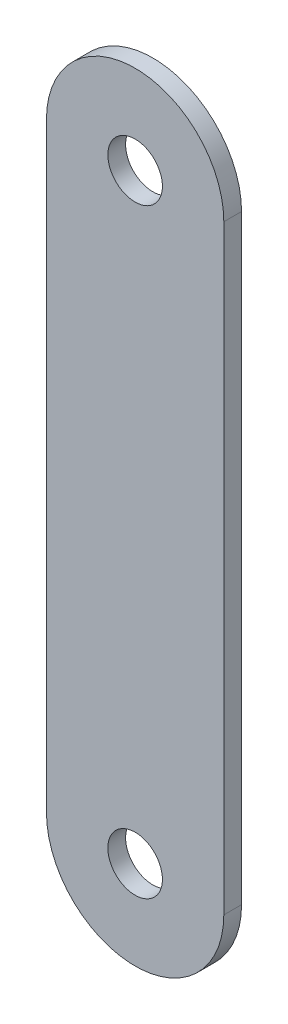
ISO-10303-21;
HEADER;
FILE_DESCRIPTION(('STEP AP214'),'2;1');
FILE_NAME('part.step','',(''),(''),'','','');
FILE_SCHEMA(('AUTOMOTIVE_DESIGN { 1 0 10303 214 1 1 1 1 }'));
ENDSEC;
DATA;
#1=APPLICATION_CONTEXT('core data for automotive mechanical design processes');
#2=APPLICATION_PROTOCOL_DEFINITION('international standard','automotive_design',2000,#1);
#3=PRODUCT_CONTEXT('',#1,'mechanical');
#4=PRODUCT('Part','Part','',(#3));
#5=PRODUCT_RELATED_PRODUCT_CATEGORY('part','',(#4));
#6=PRODUCT_DEFINITION_FORMATION('','',#4);
#7=PRODUCT_DEFINITION_CONTEXT('part definition',#1,'design');
#8=PRODUCT_DEFINITION('design','',#6,#7);
#9=PRODUCT_DEFINITION_SHAPE('','',#8);
#10=(LENGTH_UNIT() NAMED_UNIT(*) SI_UNIT(.MILLI.,.METRE.));
#11=(NAMED_UNIT(*) PLANE_ANGLE_UNIT() SI_UNIT($,.RADIAN.));
#12=(NAMED_UNIT(*) SI_UNIT($,.STERADIAN.) SOLID_ANGLE_UNIT());
#13=UNCERTAINTY_MEASURE_WITH_UNIT(LENGTH_MEASURE(1.E-05),#10,'distance_accuracy_value','');
#14=(GEOMETRIC_REPRESENTATION_CONTEXT(3) GLOBAL_UNCERTAINTY_ASSIGNED_CONTEXT((#13)) GLOBAL_UNIT_ASSIGNED_CONTEXT((#10,
#11,#12)) REPRESENTATION_CONTEXT('',''));
#15=CARTESIAN_POINT('',(0.,0.,0.));
#16=DIRECTION('',(0.,0.,1.));
#17=DIRECTION('',(1.,0.,0.));
#18=AXIS2_PLACEMENT_3D('',#15,#16,#17);
#19=CARTESIAN_POINT('',(0.,-22.,1.3));
#20=DIRECTION('',(0.,0.,1.));
#21=DIRECTION('',(1.,0.,0.));
#22=AXIS2_PLACEMENT_3D('',#19,#20,#21);
#23=PLANE('',#22);
#24=CARTESIAN_POINT('',(0.,22.,1.3));
#25=DIRECTION('',(0.,0.,1.));
#26=DIRECTION('',(1.,0.,0.));
#27=AXIS2_PLACEMENT_3D('',#24,#25,#26);
#28=CIRCLE('',#27,2.);
#29=CARTESIAN_POINT('',(1.99999999999999,22.,1.3));
#30=VERTEX_POINT('',#29);
#31=EDGE_CURVE('E102',#30,#30,#28,.T.);
#32=ORIENTED_EDGE('',*,*,#31,.F.);
#33=EDGE_LOOP('',(#32));
#34=FACE_BOUND('',#33,.T.);
#35=CARTESIAN_POINT('',(0.,-22.,1.3));
#36=DIRECTION('',(0.,0.,1.));
#37=DIRECTION('',(1.,0.,0.));
#38=AXIS2_PLACEMENT_3D('',#35,#36,#37);
#39=CIRCLE('',#38,6.5);
#40=CARTESIAN_POINT('',(-6.5,-22.,1.3));
#41=VERTEX_POINT('',#40);
#42=CARTESIAN_POINT('',(6.5,-22.,1.3));
#43=VERTEX_POINT('',#42);
#44=EDGE_CURVE('E87',#41,#43,#39,.T.);
#45=ORIENTED_EDGE('',*,*,#44,.T.);
#46=DIRECTION('',(0.,1.,0.));
#47=VECTOR('',#46,1.);
#48=CARTESIAN_POINT('',(6.5,-22.,1.3));
#49=LINE('',#48,#47);
#50=CARTESIAN_POINT('',(6.49999999999999,22.,1.3));
#51=VERTEX_POINT('',#50);
#52=EDGE_CURVE('E82',#43,#51,#49,.T.);
#53=ORIENTED_EDGE('',*,*,#52,.T.);
#54=CARTESIAN_POINT('',(0.,22.,1.3));
#55=DIRECTION('',(0.,0.,1.));
#56=DIRECTION('',(1.,0.,0.));
#57=AXIS2_PLACEMENT_3D('',#54,#55,#56);
#58=CIRCLE('',#57,6.5);
#59=CARTESIAN_POINT('',(-6.50000000000001,22.,1.3));
#60=VERTEX_POINT('',#59);
#61=EDGE_CURVE('E85',#51,#60,#58,.T.);
#62=ORIENTED_EDGE('',*,*,#61,.T.);
#63=DIRECTION('',(0.,-1.,0.));
#64=VECTOR('',#63,1.);
#65=CARTESIAN_POINT('',(-6.5,-22.,1.3));
#66=LINE('',#65,#64);
#67=EDGE_CURVE('E52',#60,#41,#66,.T.);
#68=ORIENTED_EDGE('',*,*,#67,.T.);
#69=EDGE_LOOP('',(#45,#53,#62,#68));
#70=FACE_BOUND('',#69,.T.);
#71=CARTESIAN_POINT('',(0.,-22.,1.3));
#72=DIRECTION('',(0.,0.,1.));
#73=DIRECTION('',(1.,0.,0.));
#74=AXIS2_PLACEMENT_3D('',#71,#72,#73);
#75=CIRCLE('',#74,2.);
#76=CARTESIAN_POINT('',(2.,-22.,1.3));
#77=VERTEX_POINT('',#76);
#78=EDGE_CURVE('E117',#77,#77,#75,.T.);
#79=ORIENTED_EDGE('',*,*,#78,.F.);
#80=EDGE_LOOP('',(#79));
#81=FACE_BOUND('',#80,.T.);
#82=ADVANCED_FACE('F35',(#34,#70,#81),#23,.T.);
#83=CARTESIAN_POINT('',(0.,-22.,0.));
#84=DIRECTION('',(0.,0.,1.));
#85=DIRECTION('',(1.,0.,0.));
#86=AXIS2_PLACEMENT_3D('',#83,#84,#85);
#87=PLANE('',#86);
#88=CARTESIAN_POINT('',(0.,22.,0.));
#89=DIRECTION('',(0.,0.,1.));
#90=DIRECTION('',(1.,0.,0.));
#91=AXIS2_PLACEMENT_3D('',#88,#89,#90);
#92=CIRCLE('',#91,2.);
#93=CARTESIAN_POINT('',(1.99999999999999,22.,0.));
#94=VERTEX_POINT('',#93);
#95=EDGE_CURVE('E114',#94,#94,#92,.T.);
#96=ORIENTED_EDGE('',*,*,#95,.T.);
#97=EDGE_LOOP('',(#96));
#98=FACE_BOUND('',#97,.T.);
#99=CARTESIAN_POINT('',(0.,-22.,0.));
#100=DIRECTION('',(0.,0.,1.));
#101=DIRECTION('',(1.,0.,0.));
#102=AXIS2_PLACEMENT_3D('',#99,#100,#101);
#103=CIRCLE('',#102,6.5);
#104=CARTESIAN_POINT('',(-6.5,-22.,0.));
#105=VERTEX_POINT('',#104);
#106=CARTESIAN_POINT('',(6.5,-22.,0.));
#107=VERTEX_POINT('',#106);
#108=EDGE_CURVE('E99',#105,#107,#103,.T.);
#109=ORIENTED_EDGE('',*,*,#108,.F.);
#110=DIRECTION('',(0.,-1.,0.));
#111=VECTOR('',#110,1.);
#112=CARTESIAN_POINT('',(-6.5,-22.,0.));
#113=LINE('',#112,#111);
#114=CARTESIAN_POINT('',(-6.50000000000001,22.,0.));
#115=VERTEX_POINT('',#114);
#116=EDGE_CURVE('E75',#115,#105,#113,.T.);
#117=ORIENTED_EDGE('',*,*,#116,.F.);
#118=CARTESIAN_POINT('',(0.,22.,0.));
#119=DIRECTION('',(0.,0.,1.));
#120=DIRECTION('',(1.,0.,0.));
#121=AXIS2_PLACEMENT_3D('',#118,#119,#120);
#122=CIRCLE('',#121,6.5);
#123=CARTESIAN_POINT('',(6.49999999999999,22.,0.));
#124=VERTEX_POINT('',#123);
#125=EDGE_CURVE('E69',#124,#115,#122,.T.);
#126=ORIENTED_EDGE('',*,*,#125,.F.);
#127=DIRECTION('',(0.,1.,0.));
#128=VECTOR('',#127,1.);
#129=CARTESIAN_POINT('',(6.5,-22.,0.));
#130=LINE('',#129,#128);
#131=EDGE_CURVE('E91',#107,#124,#130,.T.);
#132=ORIENTED_EDGE('',*,*,#131,.F.);
#133=EDGE_LOOP('',(#109,#117,#126,#132));
#134=FACE_BOUND('',#133,.T.);
#135=CARTESIAN_POINT('',(0.,-22.,0.));
#136=DIRECTION('',(0.,0.,1.));
#137=DIRECTION('',(1.,0.,0.));
#138=AXIS2_PLACEMENT_3D('',#135,#136,#137);
#139=CIRCLE('',#138,2.);
#140=CARTESIAN_POINT('',(2.,-22.,0.));
#141=VERTEX_POINT('',#140);
#142=EDGE_CURVE('E120',#141,#141,#139,.T.);
#143=ORIENTED_EDGE('',*,*,#142,.T.);
#144=EDGE_LOOP('',(#143));
#145=FACE_BOUND('',#144,.T.);
#146=ADVANCED_FACE('F110',(#98,#134,#145),#87,.F.);
#147=CARTESIAN_POINT('',(0.,-22.,1.3));
#148=DIRECTION('',(0.,0.,-1.));
#149=DIRECTION('',(-1.,0.,0.));
#150=AXIS2_PLACEMENT_3D('',#147,#148,#149);
#151=CYLINDRICAL_SURFACE('',#150,6.5);
#152=ORIENTED_EDGE('',*,*,#108,.T.);
#153=DIRECTION('',(0.,0.,-1.));
#154=VECTOR('',#153,1.);
#155=CARTESIAN_POINT('',(6.5,-22.,1.3));
#156=LINE('',#155,#154);
#157=EDGE_CURVE('E11',#43,#107,#156,.T.);
#158=ORIENTED_EDGE('',*,*,#157,.F.);
#159=ORIENTED_EDGE('',*,*,#44,.F.);
#160=DIRECTION('',(0.,0.,-1.));
#161=VECTOR('',#160,1.);
#162=CARTESIAN_POINT('',(-6.5,-22.,1.3));
#163=LINE('',#162,#161);
#164=EDGE_CURVE('E95',#41,#105,#163,.T.);
#165=ORIENTED_EDGE('',*,*,#164,.T.);
#166=EDGE_LOOP('',(#152,#158,#159,#165));
#167=FACE_BOUND('',#166,.T.);
#168=ADVANCED_FACE('F37',(#167),#151,.T.);
#169=CARTESIAN_POINT('',(6.5,-22.,1.3));
#170=DIRECTION('',(-1.,0.,0.));
#171=DIRECTION('',(0.,-1.,0.));
#172=AXIS2_PLACEMENT_3D('',#169,#170,#171);
#173=PLANE('',#172);
#174=ORIENTED_EDGE('',*,*,#131,.T.);
#175=DIRECTION('',(0.,0.,-1.));
#176=VECTOR('',#175,1.);
#177=CARTESIAN_POINT('',(6.49999999999999,22.,1.3));
#178=LINE('',#177,#176);
#179=EDGE_CURVE('E44',#51,#124,#178,.T.);
#180=ORIENTED_EDGE('',*,*,#179,.F.);
#181=ORIENTED_EDGE('',*,*,#52,.F.);
#182=ORIENTED_EDGE('',*,*,#157,.T.);
#183=EDGE_LOOP('',(#174,#180,#181,#182));
#184=FACE_BOUND('',#183,.T.);
#185=ADVANCED_FACE('F90',(#184),#173,.F.);
#186=CARTESIAN_POINT('',(0.,22.,1.3));
#187=DIRECTION('',(0.,0.,-1.));
#188=DIRECTION('',(-1.,0.,0.));
#189=AXIS2_PLACEMENT_3D('',#186,#187,#188);
#190=CYLINDRICAL_SURFACE('',#189,6.5);
#191=ORIENTED_EDGE('',*,*,#125,.T.);
#192=DIRECTION('',(0.,0.,-1.));
#193=VECTOR('',#192,1.);
#194=CARTESIAN_POINT('',(-6.50000000000001,22.,1.3));
#195=LINE('',#194,#193);
#196=EDGE_CURVE('E92',#60,#115,#195,.T.);
#197=ORIENTED_EDGE('',*,*,#196,.F.);
#198=ORIENTED_EDGE('',*,*,#61,.F.);
#199=ORIENTED_EDGE('',*,*,#179,.T.);
#200=EDGE_LOOP('',(#191,#197,#198,#199));
#201=FACE_BOUND('',#200,.T.);
#202=ADVANCED_FACE('F93',(#201),#190,.T.);
#203=CARTESIAN_POINT('',(-6.5,-22.,1.3));
#204=DIRECTION('',(1.,0.,0.));
#205=DIRECTION('',(0.,1.,0.));
#206=AXIS2_PLACEMENT_3D('',#203,#204,#205);
#207=PLANE('',#206);
#208=ORIENTED_EDGE('',*,*,#116,.T.);
#209=ORIENTED_EDGE('',*,*,#164,.F.);
#210=ORIENTED_EDGE('',*,*,#67,.F.);
#211=ORIENTED_EDGE('',*,*,#196,.T.);
#212=EDGE_LOOP('',(#208,#209,#210,#211));
#213=FACE_BOUND('',#212,.T.);
#214=ADVANCED_FACE('F107',(#213),#207,.F.);
#215=CARTESIAN_POINT('',(0.,22.,1.3));
#216=DIRECTION('',(0.,0.,-1.));
#217=DIRECTION('',(-1.,0.,0.));
#218=AXIS2_PLACEMENT_3D('',#215,#216,#217);
#219=CYLINDRICAL_SURFACE('',#218,2.);
#220=ORIENTED_EDGE('',*,*,#31,.T.);
#221=EDGE_LOOP('',(#220));
#222=FACE_BOUND('',#221,.T.);
#223=ORIENTED_EDGE('',*,*,#95,.F.);
#224=EDGE_LOOP('',(#223));
#225=FACE_BOUND('',#224,.T.);
#226=ADVANCED_FACE('F138',(#222,#225),#219,.F.);
#227=CARTESIAN_POINT('',(0.,-22.,1.3));
#228=DIRECTION('',(0.,0.,-1.));
#229=DIRECTION('',(-1.,0.,0.));
#230=AXIS2_PLACEMENT_3D('',#227,#228,#229);
#231=CYLINDRICAL_SURFACE('',#230,2.);
#232=ORIENTED_EDGE('',*,*,#78,.T.);
#233=EDGE_LOOP('',(#232));
#234=FACE_BOUND('',#233,.T.);
#235=ORIENTED_EDGE('',*,*,#142,.F.);
#236=EDGE_LOOP('',(#235));
#237=FACE_BOUND('',#236,.T.);
#238=ADVANCED_FACE('F126',(#234,#237),#231,.F.);
#239=CLOSED_SHELL('',(#82,#146,#168,#185,#202,#214,#226,#238));
#240=MANIFOLD_SOLID_BREP('B2',#239);
#241=ADVANCED_BREP_SHAPE_REPRESENTATION('',(#18,#240),#14);
#242=SHAPE_DEFINITION_REPRESENTATION(#9,#241);
ENDSEC;
END-ISO-10303-21;
